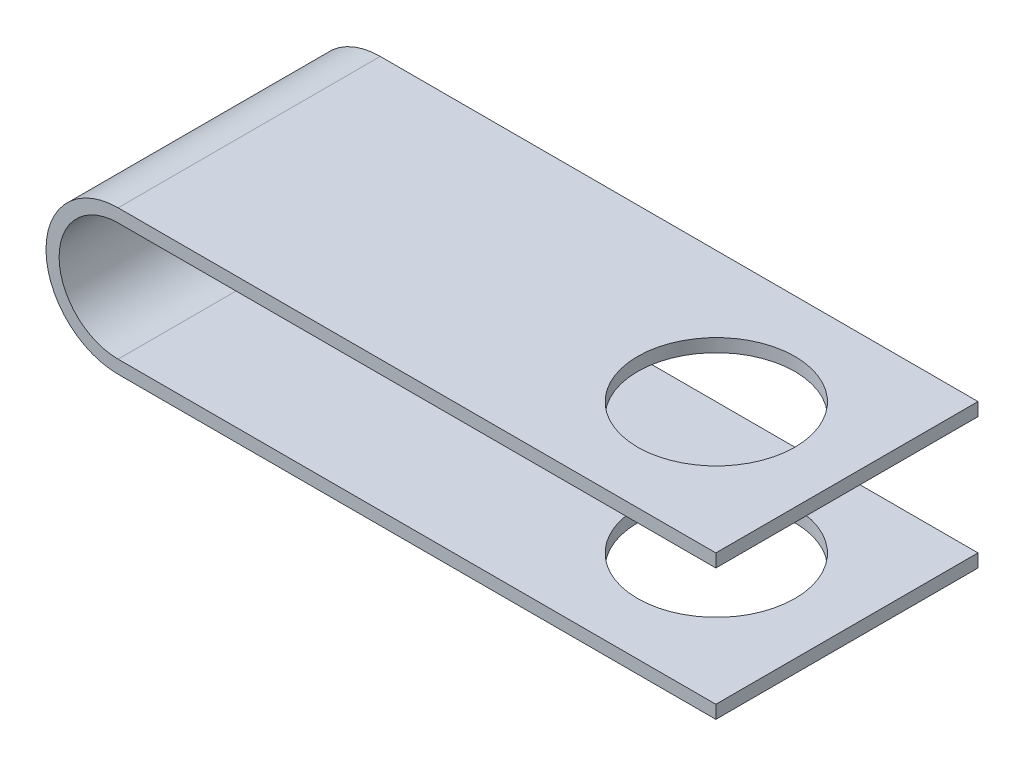
ISO-10303-21;
HEADER;
FILE_DESCRIPTION(('STEP AP214'),'2;1');
FILE_NAME('part.step','',(''),(''),'','','');
FILE_SCHEMA(('AUTOMOTIVE_DESIGN { 1 0 10303 214 1 1 1 1 }'));
ENDSEC;
DATA;
#1=APPLICATION_CONTEXT('core data for automotive mechanical design processes');
#2=APPLICATION_PROTOCOL_DEFINITION('international standard','automotive_design',2000,#1);
#3=PRODUCT_CONTEXT('',#1,'mechanical');
#4=PRODUCT('Part','Part','',(#3));
#5=PRODUCT_RELATED_PRODUCT_CATEGORY('part','',(#4));
#6=PRODUCT_DEFINITION_FORMATION('','',#4);
#7=PRODUCT_DEFINITION_CONTEXT('part definition',#1,'design');
#8=PRODUCT_DEFINITION('design','',#6,#7);
#9=PRODUCT_DEFINITION_SHAPE('','',#8);
#10=(LENGTH_UNIT() NAMED_UNIT(*) SI_UNIT(.MILLI.,.METRE.));
#11=(NAMED_UNIT(*) PLANE_ANGLE_UNIT() SI_UNIT($,.RADIAN.));
#12=(NAMED_UNIT(*) SI_UNIT($,.STERADIAN.) SOLID_ANGLE_UNIT());
#13=UNCERTAINTY_MEASURE_WITH_UNIT(LENGTH_MEASURE(1.E-05),#10,'distance_accuracy_value','');
#14=(GEOMETRIC_REPRESENTATION_CONTEXT(3) GLOBAL_UNCERTAINTY_ASSIGNED_CONTEXT((#13)) GLOBAL_UNIT_ASSIGNED_CONTEXT((#10,
#11,#12)) REPRESENTATION_CONTEXT('',''));
#15=CARTESIAN_POINT('',(0.,0.,0.));
#16=DIRECTION('',(0.,0.,1.));
#17=DIRECTION('',(1.,0.,0.));
#18=AXIS2_PLACEMENT_3D('',#15,#16,#17);
#19=CARTESIAN_POINT('',(-57.912,6.98499999999999,25.4));
#20=DIRECTION('',(0.,0.,-1.));
#21=DIRECTION('',(-1.,0.,0.));
#22=AXIS2_PLACEMENT_3D('',#19,#20,#21);
#23=CYLINDRICAL_SURFACE('',#22,6.985);
#24=CARTESIAN_POINT('',(-57.912,6.98499999999999,0.));
#25=DIRECTION('',(0.,0.,1.));
#26=DIRECTION('',(1.,0.,0.));
#27=AXIS2_PLACEMENT_3D('',#24,#25,#26);
#28=CIRCLE('',#27,6.985);
#29=CARTESIAN_POINT('',(-57.912,0.,0.));
#30=VERTEX_POINT('',#29);
#31=CARTESIAN_POINT('',(-57.912,13.97,0.));
#32=VERTEX_POINT('',#31);
#33=EDGE_CURVE('E125',#30,#32,#28,.F.);
#34=ORIENTED_EDGE('',*,*,#33,.F.);
#35=DIRECTION('',(0.,0.,-1.));
#36=VECTOR('',#35,1.);
#37=CARTESIAN_POINT('',(-57.912,0.,25.4));
#38=LINE('',#37,#36);
#39=CARTESIAN_POINT('',(-57.912,0.,25.4));
#40=VERTEX_POINT('',#39);
#41=EDGE_CURVE('E11',#40,#30,#38,.T.);
#42=ORIENTED_EDGE('',*,*,#41,.F.);
#43=CARTESIAN_POINT('',(-57.912,6.98499999999999,25.4));
#44=DIRECTION('',(0.,0.,1.));
#45=DIRECTION('',(1.,0.,0.));
#46=AXIS2_PLACEMENT_3D('',#43,#44,#45);
#47=CIRCLE('',#46,6.985);
#48=CARTESIAN_POINT('',(-57.912,13.97,25.4));
#49=VERTEX_POINT('',#48);
#50=EDGE_CURVE('E145',#40,#49,#47,.F.);
#51=ORIENTED_EDGE('',*,*,#50,.T.);
#52=DIRECTION('',(0.,0.,-1.));
#53=VECTOR('',#52,1.);
#54=CARTESIAN_POINT('',(-57.912,13.97,25.4));
#55=LINE('',#54,#53);
#56=EDGE_CURVE('E83',#49,#32,#55,.T.);
#57=ORIENTED_EDGE('',*,*,#56,.T.);
#58=EDGE_LOOP('',(#34,#42,#51,#57));
#59=FACE_BOUND('',#58,.T.);
#60=ADVANCED_FACE('F33',(#59),#23,.T.);
#61=CARTESIAN_POINT('',(0.,0.,25.4));
#62=DIRECTION('',(0.,-1.,0.));
#63=DIRECTION('',(0.,0.,-1.));
#64=AXIS2_PLACEMENT_3D('',#61,#62,#63);
#65=PLANE('',#64);
#66=CARTESIAN_POINT('',(-12.6570791402944,0.,12.7));
#67=DIRECTION('',(0.,-1.,0.));
#68=DIRECTION('',(0.,0.,-1.));
#69=AXIS2_PLACEMENT_3D('',#66,#67,#68);
#70=CIRCLE('',#69,7.62);
#71=CARTESIAN_POINT('',(-12.6570791402944,0.,5.08));
#72=VERTEX_POINT('',#71);
#73=EDGE_CURVE('E129',#72,#72,#70,.T.);
#74=ORIENTED_EDGE('',*,*,#73,.F.);
#75=EDGE_LOOP('',(#74));
#76=FACE_BOUND('',#75,.T.);
#77=DIRECTION('',(-1.,0.,0.));
#78=VECTOR('',#77,1.);
#79=CARTESIAN_POINT('',(0.,0.,0.));
#80=LINE('',#79,#78);
#81=CARTESIAN_POINT('',(0.,0.,0.));
#82=VERTEX_POINT('',#81);
#83=EDGE_CURVE('E128',#82,#30,#80,.T.);
#84=ORIENTED_EDGE('',*,*,#83,.F.);
#85=DIRECTION('',(0.,0.,-1.));
#86=VECTOR('',#85,1.);
#87=CARTESIAN_POINT('',(0.,0.,25.4));
#88=LINE('',#87,#86);
#89=CARTESIAN_POINT('',(0.,0.,25.4));
#90=VERTEX_POINT('',#89);
#91=EDGE_CURVE('E41',#90,#82,#88,.T.);
#92=ORIENTED_EDGE('',*,*,#91,.F.);
#93=DIRECTION('',(-1.,0.,0.));
#94=VECTOR('',#93,1.);
#95=CARTESIAN_POINT('',(0.,0.,25.4));
#96=LINE('',#95,#94);
#97=EDGE_CURVE('E178',#90,#40,#96,.T.);
#98=ORIENTED_EDGE('',*,*,#97,.T.);
#99=ORIENTED_EDGE('',*,*,#41,.T.);
#100=EDGE_LOOP('',(#84,#92,#98,#99));
#101=FACE_BOUND('',#100,.T.);
#102=ADVANCED_FACE('F163',(#76,#101),#65,.T.);
#103=CARTESIAN_POINT('',(0.,0.,25.4));
#104=DIRECTION('',(1.,0.,0.));
#105=DIRECTION('',(0.,0.,-1.));
#106=AXIS2_PLACEMENT_3D('',#103,#104,#105);
#107=PLANE('',#106);
#108=DIRECTION('',(0.,-1.,0.));
#109=VECTOR('',#108,1.);
#110=CARTESIAN_POINT('',(0.,0.,0.));
#111=LINE('',#110,#109);
#112=CARTESIAN_POINT('',(0.,1.27,0.));
#113=VERTEX_POINT('',#112);
#114=EDGE_CURVE('E132',#113,#82,#111,.T.);
#115=ORIENTED_EDGE('',*,*,#114,.F.);
#116=DIRECTION('',(0.,0.,-1.));
#117=VECTOR('',#116,1.);
#118=CARTESIAN_POINT('',(0.,1.27,25.4));
#119=LINE('',#118,#117);
#120=CARTESIAN_POINT('',(0.,1.27,25.4));
#121=VERTEX_POINT('',#120);
#122=EDGE_CURVE('E152',#121,#113,#119,.T.);
#123=ORIENTED_EDGE('',*,*,#122,.F.);
#124=DIRECTION('',(0.,-1.,0.));
#125=VECTOR('',#124,1.);
#126=CARTESIAN_POINT('',(0.,0.,25.4));
#127=LINE('',#126,#125);
#128=EDGE_CURVE('E159',#121,#90,#127,.T.);
#129=ORIENTED_EDGE('',*,*,#128,.T.);
#130=ORIENTED_EDGE('',*,*,#91,.T.);
#131=EDGE_LOOP('',(#115,#123,#129,#130));
#132=FACE_BOUND('',#131,.T.);
#133=ADVANCED_FACE('F157',(#132),#107,.T.);
#134=CARTESIAN_POINT('',(0.,1.27,25.4));
#135=DIRECTION('',(0.,-1.,0.));
#136=DIRECTION('',(0.,0.,-1.));
#137=AXIS2_PLACEMENT_3D('',#134,#135,#136);
#138=PLANE('',#137);
#139=CARTESIAN_POINT('',(-12.6570791402944,1.27,12.7));
#140=DIRECTION('',(0.,-1.,0.));
#141=DIRECTION('',(0.,0.,-1.));
#142=AXIS2_PLACEMENT_3D('',#139,#140,#141);
#143=CIRCLE('',#142,7.62);
#144=CARTESIAN_POINT('',(-12.6570791402944,1.27,5.08));
#145=VERTEX_POINT('',#144);
#146=EDGE_CURVE('E183',#145,#145,#143,.T.);
#147=ORIENTED_EDGE('',*,*,#146,.T.);
#148=EDGE_LOOP('',(#147));
#149=FACE_BOUND('',#148,.T.);
#150=DIRECTION('',(-1.,0.,0.));
#151=VECTOR('',#150,1.);
#152=CARTESIAN_POINT('',(0.,1.27,0.));
#153=LINE('',#152,#151);
#154=CARTESIAN_POINT('',(-57.912,1.27,0.));
#155=VERTEX_POINT('',#154);
#156=EDGE_CURVE('E135',#113,#155,#153,.T.);
#157=ORIENTED_EDGE('',*,*,#156,.T.);
#158=DIRECTION('',(0.,0.,-1.));
#159=VECTOR('',#158,1.);
#160=CARTESIAN_POINT('',(-57.912,1.27,25.4));
#161=LINE('',#160,#159);
#162=CARTESIAN_POINT('',(-57.912,1.27,25.4));
#163=VERTEX_POINT('',#162);
#164=EDGE_CURVE('E149',#163,#155,#161,.T.);
#165=ORIENTED_EDGE('',*,*,#164,.F.);
#166=DIRECTION('',(-1.,0.,0.));
#167=VECTOR('',#166,1.);
#168=CARTESIAN_POINT('',(0.,1.27,25.4));
#169=LINE('',#168,#167);
#170=EDGE_CURVE('E174',#121,#163,#169,.T.);
#171=ORIENTED_EDGE('',*,*,#170,.F.);
#172=ORIENTED_EDGE('',*,*,#122,.T.);
#173=EDGE_LOOP('',(#157,#165,#171,#172));
#174=FACE_BOUND('',#173,.T.);
#175=ADVANCED_FACE('F170',(#149,#174),#138,.F.);
#176=CARTESIAN_POINT('',(-57.912,6.985,25.4));
#177=DIRECTION('',(0.,0.,-1.));
#178=DIRECTION('',(-1.,0.,0.));
#179=AXIS2_PLACEMENT_3D('',#176,#177,#178);
#180=CYLINDRICAL_SURFACE('',#179,5.715);
#181=CARTESIAN_POINT('',(-57.912,6.985,0.));
#182=DIRECTION('',(0.,0.,1.));
#183=DIRECTION('',(1.,0.,0.));
#184=AXIS2_PLACEMENT_3D('',#181,#182,#183);
#185=CIRCLE('',#184,5.715);
#186=CARTESIAN_POINT('',(-57.912,12.7,0.));
#187=VERTEX_POINT('',#186);
#188=EDGE_CURVE('E137',#155,#187,#185,.F.);
#189=ORIENTED_EDGE('',*,*,#188,.T.);
#190=DIRECTION('',(0.,0.,-1.));
#191=VECTOR('',#190,1.);
#192=CARTESIAN_POINT('',(-57.912,12.7,25.4));
#193=LINE('',#192,#191);
#194=CARTESIAN_POINT('',(-57.912,12.7,25.4));
#195=VERTEX_POINT('',#194);
#196=EDGE_CURVE('E112',#195,#187,#193,.T.);
#197=ORIENTED_EDGE('',*,*,#196,.F.);
#198=CARTESIAN_POINT('',(-57.912,6.985,25.4));
#199=DIRECTION('',(0.,0.,1.));
#200=DIRECTION('',(1.,0.,0.));
#201=AXIS2_PLACEMENT_3D('',#198,#199,#200);
#202=CIRCLE('',#201,5.715);
#203=EDGE_CURVE('E117',#163,#195,#202,.F.);
#204=ORIENTED_EDGE('',*,*,#203,.F.);
#205=ORIENTED_EDGE('',*,*,#164,.T.);
#206=EDGE_LOOP('',(#189,#197,#204,#205));
#207=FACE_BOUND('',#206,.T.);
#208=ADVANCED_FACE('F173',(#207),#180,.F.);
#209=CARTESIAN_POINT('',(0.,12.7,25.4));
#210=DIRECTION('',(0.,-1.,0.));
#211=DIRECTION('',(0.,0.,-1.));
#212=AXIS2_PLACEMENT_3D('',#209,#210,#211);
#213=PLANE('',#212);
#214=CARTESIAN_POINT('',(-12.6570791402944,12.7,12.7));
#215=DIRECTION('',(0.,-1.,0.));
#216=DIRECTION('',(0.,0.,-1.));
#217=AXIS2_PLACEMENT_3D('',#214,#215,#216);
#218=CIRCLE('',#217,7.62);
#219=CARTESIAN_POINT('',(-12.6570791402944,12.7,5.08));
#220=VERTEX_POINT('',#219);
#221=EDGE_CURVE('E186',#220,#220,#218,.T.);
#222=ORIENTED_EDGE('',*,*,#221,.F.);
#223=EDGE_LOOP('',(#222));
#224=FACE_BOUND('',#223,.T.);
#225=DIRECTION('',(-1.,0.,0.));
#226=VECTOR('',#225,1.);
#227=CARTESIAN_POINT('',(0.,12.7,0.));
#228=LINE('',#227,#226);
#229=CARTESIAN_POINT('',(0.,12.7,0.));
#230=VERTEX_POINT('',#229);
#231=EDGE_CURVE('E107',#230,#187,#228,.T.);
#232=ORIENTED_EDGE('',*,*,#231,.F.);
#233=DIRECTION('',(0.,0.,-1.));
#234=VECTOR('',#233,1.);
#235=CARTESIAN_POINT('',(0.,12.7,25.4));
#236=LINE('',#235,#234);
#237=CARTESIAN_POINT('',(0.,12.7,25.4));
#238=VERTEX_POINT('',#237);
#239=EDGE_CURVE('E102',#238,#230,#236,.T.);
#240=ORIENTED_EDGE('',*,*,#239,.F.);
#241=DIRECTION('',(-1.,0.,0.));
#242=VECTOR('',#241,1.);
#243=CARTESIAN_POINT('',(0.,12.7,25.4));
#244=LINE('',#243,#242);
#245=EDGE_CURVE('E105',#238,#195,#244,.T.);
#246=ORIENTED_EDGE('',*,*,#245,.T.);
#247=ORIENTED_EDGE('',*,*,#196,.T.);
#248=EDGE_LOOP('',(#232,#240,#246,#247));
#249=FACE_BOUND('',#248,.T.);
#250=ADVANCED_FACE('F104',(#224,#249),#213,.T.);
#251=CARTESIAN_POINT('',(0.,0.,25.4));
#252=DIRECTION('',(1.,0.,0.));
#253=DIRECTION('',(0.,1.,0.));
#254=AXIS2_PLACEMENT_3D('',#251,#252,#253);
#255=PLANE('',#254);
#256=DIRECTION('',(0.,-1.,0.));
#257=VECTOR('',#256,1.);
#258=CARTESIAN_POINT('',(0.,0.,0.));
#259=LINE('',#258,#257);
#260=CARTESIAN_POINT('',(0.,13.97,0.));
#261=VERTEX_POINT('',#260);
#262=EDGE_CURVE('E141',#261,#230,#259,.T.);
#263=ORIENTED_EDGE('',*,*,#262,.F.);
#264=DIRECTION('',(0.,0.,-1.));
#265=VECTOR('',#264,1.);
#266=CARTESIAN_POINT('',(0.,13.97,25.4));
#267=LINE('',#266,#265);
#268=CARTESIAN_POINT('',(0.,13.97,25.4));
#269=VERTEX_POINT('',#268);
#270=EDGE_CURVE('E76',#269,#261,#267,.T.);
#271=ORIENTED_EDGE('',*,*,#270,.F.);
#272=DIRECTION('',(0.,-1.,0.));
#273=VECTOR('',#272,1.);
#274=CARTESIAN_POINT('',(0.,0.,25.4));
#275=LINE('',#274,#273);
#276=EDGE_CURVE('E115',#269,#238,#275,.T.);
#277=ORIENTED_EDGE('',*,*,#276,.T.);
#278=ORIENTED_EDGE('',*,*,#239,.T.);
#279=EDGE_LOOP('',(#263,#271,#277,#278));
#280=FACE_BOUND('',#279,.T.);
#281=ADVANCED_FACE('F120',(#280),#255,.T.);
#282=CARTESIAN_POINT('',(0.,13.97,25.4));
#283=DIRECTION('',(0.,-1.,0.));
#284=DIRECTION('',(1.,0.,0.));
#285=AXIS2_PLACEMENT_3D('',#282,#283,#284);
#286=PLANE('',#285);
#287=CARTESIAN_POINT('',(-12.6570791402944,13.97,12.7));
#288=DIRECTION('',(0.,1.,0.));
#289=DIRECTION('',(-1.,0.,0.));
#290=AXIS2_PLACEMENT_3D('',#287,#288,#289);
#291=CIRCLE('',#290,7.62);
#292=CARTESIAN_POINT('',(-20.2770791402944,13.97,12.7));
#293=VERTEX_POINT('',#292);
#294=EDGE_CURVE('E189',#293,#293,#291,.T.);
#295=ORIENTED_EDGE('',*,*,#294,.F.);
#296=EDGE_LOOP('',(#295));
#297=FACE_BOUND('',#296,.T.);
#298=DIRECTION('',(-1.,0.,0.));
#299=VECTOR('',#298,1.);
#300=CARTESIAN_POINT('',(0.,13.97,0.));
#301=LINE('',#300,#299);
#302=EDGE_CURVE('E143',#261,#32,#301,.T.);
#303=ORIENTED_EDGE('',*,*,#302,.T.);
#304=ORIENTED_EDGE('',*,*,#56,.F.);
#305=DIRECTION('',(-1.,0.,0.));
#306=VECTOR('',#305,1.);
#307=CARTESIAN_POINT('',(0.,13.97,25.4));
#308=LINE('',#307,#306);
#309=EDGE_CURVE('E49',#269,#49,#308,.T.);
#310=ORIENTED_EDGE('',*,*,#309,.F.);
#311=ORIENTED_EDGE('',*,*,#270,.T.);
#312=EDGE_LOOP('',(#303,#304,#310,#311));
#313=FACE_BOUND('',#312,.T.);
#314=ADVANCED_FACE('F195',(#297,#313),#286,.F.);
#315=CARTESIAN_POINT('',(0.,0.,25.4));
#316=DIRECTION('',(0.,0.,1.));
#317=DIRECTION('',(1.,0.,0.));
#318=AXIS2_PLACEMENT_3D('',#315,#316,#317);
#319=PLANE('',#318);
#320=ORIENTED_EDGE('',*,*,#50,.F.);
#321=ORIENTED_EDGE('',*,*,#97,.F.);
#322=ORIENTED_EDGE('',*,*,#128,.F.);
#323=ORIENTED_EDGE('',*,*,#170,.T.);
#324=ORIENTED_EDGE('',*,*,#203,.T.);
#325=ORIENTED_EDGE('',*,*,#245,.F.);
#326=ORIENTED_EDGE('',*,*,#276,.F.);
#327=ORIENTED_EDGE('',*,*,#309,.T.);
#328=EDGE_LOOP('',(#320,#321,#322,#323,#324,#325,#326,#327));
#329=FACE_BOUND('',#328,.T.);
#330=ADVANCED_FACE('F114',(#329),#319,.T.);
#331=CARTESIAN_POINT('',(0.,0.,0.));
#332=DIRECTION('',(0.,0.,1.));
#333=DIRECTION('',(1.,0.,0.));
#334=AXIS2_PLACEMENT_3D('',#331,#332,#333);
#335=PLANE('',#334);
#336=ORIENTED_EDGE('',*,*,#33,.T.);
#337=ORIENTED_EDGE('',*,*,#302,.F.);
#338=ORIENTED_EDGE('',*,*,#262,.T.);
#339=ORIENTED_EDGE('',*,*,#231,.T.);
#340=ORIENTED_EDGE('',*,*,#188,.F.);
#341=ORIENTED_EDGE('',*,*,#156,.F.);
#342=ORIENTED_EDGE('',*,*,#114,.T.);
#343=ORIENTED_EDGE('',*,*,#83,.T.);
#344=EDGE_LOOP('',(#336,#337,#338,#339,#340,#341,#342,#343));
#345=FACE_BOUND('',#344,.T.);
#346=ADVANCED_FACE('F166',(#345),#335,.F.);
#347=CARTESIAN_POINT('',(-12.6570791402944,-11.43,12.7));
#348=DIRECTION('',(0.,1.,0.));
#349=DIRECTION('',(-1.,0.,0.));
#350=AXIS2_PLACEMENT_3D('',#347,#348,#349);
#351=CYLINDRICAL_SURFACE('',#350,7.62);
#352=ORIENTED_EDGE('',*,*,#221,.T.);
#353=EDGE_LOOP('',(#352));
#354=FACE_BOUND('',#353,.T.);
#355=ORIENTED_EDGE('',*,*,#294,.T.);
#356=EDGE_LOOP('',(#355));
#357=FACE_BOUND('',#356,.T.);
#358=ADVANCED_FACE('F193',(#354,#357),#351,.F.);
#359=ORIENTED_EDGE('',*,*,#73,.T.);
#360=EDGE_LOOP('',(#359));
#361=FACE_BOUND('',#360,.T.);
#362=ORIENTED_EDGE('',*,*,#146,.F.);
#363=EDGE_LOOP('',(#362));
#364=FACE_BOUND('',#363,.T.);
#365=ADVANCED_FACE('F224',(#361,#364),#351,.F.);
#366=CLOSED_SHELL('',(#60,#102,#133,#175,#208,#250,#281,#314,#330,#346,#358,#365));
#367=MANIFOLD_SOLID_BREP('B2',#366);
#368=ADVANCED_BREP_SHAPE_REPRESENTATION('',(#18,#367),#14);
#369=SHAPE_DEFINITION_REPRESENTATION(#9,#368);
ENDSEC;
END-ISO-10303-21;
